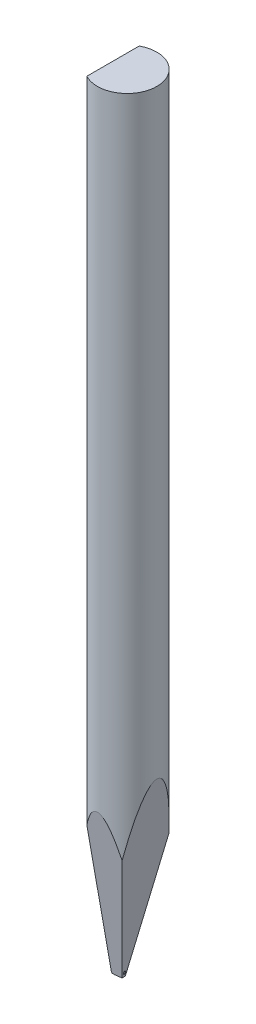
ISO-10303-21;
HEADER;
FILE_DESCRIPTION(('STEP AP214'),'2;1');
FILE_NAME('part.step','',(''),(''),'','','');
FILE_SCHEMA(('AUTOMOTIVE_DESIGN { 1 0 10303 214 1 1 1 1 }'));
ENDSEC;
DATA;
#1=APPLICATION_CONTEXT('core data for automotive mechanical design processes');
#2=APPLICATION_PROTOCOL_DEFINITION('international standard','automotive_design',2000,#1);
#3=PRODUCT_CONTEXT('',#1,'mechanical');
#4=PRODUCT('Part','Part','',(#3));
#5=PRODUCT_RELATED_PRODUCT_CATEGORY('part','',(#4));
#6=PRODUCT_DEFINITION_FORMATION('','',#4);
#7=PRODUCT_DEFINITION_CONTEXT('part definition',#1,'design');
#8=PRODUCT_DEFINITION('design','',#6,#7);
#9=PRODUCT_DEFINITION_SHAPE('','',#8);
#10=(LENGTH_UNIT() NAMED_UNIT(*) SI_UNIT(.MILLI.,.METRE.));
#11=(NAMED_UNIT(*) PLANE_ANGLE_UNIT() SI_UNIT($,.RADIAN.));
#12=(NAMED_UNIT(*) SI_UNIT($,.STERADIAN.) SOLID_ANGLE_UNIT());
#13=UNCERTAINTY_MEASURE_WITH_UNIT(LENGTH_MEASURE(1.E-05),#10,'distance_accuracy_value','');
#14=(GEOMETRIC_REPRESENTATION_CONTEXT(3) GLOBAL_UNCERTAINTY_ASSIGNED_CONTEXT((#13)) GLOBAL_UNIT_ASSIGNED_CONTEXT((#10,
#11,#12)) REPRESENTATION_CONTEXT('',''));
#15=CARTESIAN_POINT('',(0.,0.,0.));
#16=DIRECTION('',(0.,0.,1.));
#17=DIRECTION('',(1.,0.,0.));
#18=AXIS2_PLACEMENT_3D('',#15,#16,#17);
#19=CARTESIAN_POINT('',(26.8738719491216,0.,0.0381));
#20=DIRECTION('',(0.,-0.173648177666931,0.984807753012208));
#21=DIRECTION('',(0.,-0.984807753012208,-0.173648177666931));
#22=AXIS2_PLACEMENT_3D('',#19,#20,#21);
#23=PLANE('',#22);
#24=CARTESIAN_POINT('',(-0.34808,0.02794,0.0430265758409945));
#25=DIRECTION('',(0.,-0.173648177666931,0.984807753012208));
#26=DIRECTION('',(0.,-0.984807753012208,-0.173648177666931));
#27=AXIS2_PLACEMENT_3D('',#24,#25,#26);
#28=ELLIPSE('',#27,0.0283710195360877,0.02794);
#29=CARTESIAN_POINT('',(-0.34808,0.,0.0381));
#30=VERTEX_POINT('',#29);
#31=CARTESIAN_POINT('',(-0.37592,0.0255782210094903,0.0426101304824979));
#32=VERTEX_POINT('',#31);
#33=EDGE_CURVE('E68',#30,#32,#28,.F.);
#34=ORIENTED_EDGE('',*,*,#33,.F.);
#35=DIRECTION('',(-1.,0.,0.));
#36=VECTOR('',#35,1.);
#37=CARTESIAN_POINT('',(26.8738719491216,0.,0.0381));
#38=LINE('',#37,#36);
#39=CARTESIAN_POINT('',(-0.292099999999995,0.,0.0381000000000001));
#40=VERTEX_POINT('',#39);
#41=EDGE_CURVE('E423',#40,#30,#38,.T.);
#42=ORIENTED_EDGE('',*,*,#41,.F.);
#43=DIRECTION('',(-0.98997002855162,-0.139131214142995,-0.0245325869121374));
#44=VECTOR('',#43,1.);
#45=CARTESIAN_POINT('',(26.3316570087555,3.74172503292415,0.697867077696801));
#46=LINE('',#45,#44);
#47=CARTESIAN_POINT('',(-0.0915501457750264,0.0281854439122204,0.0430698542249696));
#48=VERTEX_POINT('',#47);
#49=EDGE_CURVE('E431',#48,#40,#46,.T.);
#50=ORIENTED_EDGE('',*,*,#49,.F.);
#51=DIRECTION('',(-0.171087869746036,-0.970287525247814,-0.171087869746036));
#52=VECTOR('',#51,1.);
#53=CARTESIAN_POINT('',(0.692931938695095,4.47720442738341,0.827551938695093));
#54=LINE('',#53,#52);
#55=CARTESIAN_POINT('',(0.489000739695002,3.32065312604135,0.623620739695));
#56=VERTEX_POINT('',#55);
#57=EDGE_CURVE('E484',#56,#48,#54,.T.);
#58=ORIENTED_EDGE('',*,*,#57,.F.);
#59=CARTESIAN_POINT('',(0.,-0.216075837327433,0.));
#60=DIRECTION('',(0.,-0.173648177666931,0.984807753012208));
#61=DIRECTION('',(0.,-0.984807753012208,-0.173648177666931));
#62=AXIS2_PLACEMENT_3D('',#59,#60,#61);
#63=ELLIPSE('',#62,4.56371043248163,0.792479999999998);
#64=CARTESIAN_POINT('',(-0.37592,3.74046620982329,0.69764511322018));
#65=VERTEX_POINT('',#64);
#66=EDGE_CURVE('E441',#56,#65,#63,.T.);
#67=ORIENTED_EDGE('',*,*,#66,.T.);
#68=DIRECTION('',(0.,0.984807753012208,0.173648177666931));
#69=VECTOR('',#68,1.);
#70=CARTESIAN_POINT('',(-0.37592,20.2532840805181,3.60930043134861));
#71=LINE('',#70,#69);
#72=EDGE_CURVE('E54',#32,#65,#71,.T.);
#73=ORIENTED_EDGE('',*,*,#72,.F.);
#74=EDGE_LOOP('',(#34,#42,#50,#58,#67,#73));
#75=FACE_BOUND('',#74,.T.);
#76=ADVANCED_FACE('F46',(#75),#23,.T.);
#77=CARTESIAN_POINT('',(26.8738719491216,0.,-0.0381));
#78=DIRECTION('',(0.,-0.173648177666931,-0.984807753012208));
#79=DIRECTION('',(0.,0.984807753012208,-0.173648177666931));
#80=AXIS2_PLACEMENT_3D('',#77,#78,#79);
#81=PLANE('',#80);
#82=CARTESIAN_POINT('',(-0.34808,0.02794,-0.0430265758409945));
#83=DIRECTION('',(0.,-0.173648177666931,-0.984807753012208));
#84=DIRECTION('',(0.,0.984807753012208,-0.173648177666931));
#85=AXIS2_PLACEMENT_3D('',#82,#83,#84);
#86=ELLIPSE('',#85,0.0283710195360877,0.02794);
#87=CARTESIAN_POINT('',(-0.37592,0.0255782210094868,-0.042610130482497));
#88=VERTEX_POINT('',#87);
#89=CARTESIAN_POINT('',(-0.34808,0.,-0.0381));
#90=VERTEX_POINT('',#89);
#91=EDGE_CURVE('E189',#88,#90,#86,.F.);
#92=ORIENTED_EDGE('',*,*,#91,.F.);
#93=DIRECTION('',(0.,-0.984807753012208,0.173648177666931));
#94=VECTOR('',#93,1.);
#95=CARTESIAN_POINT('',(-0.37592,20.5277483982937,-3.65769589581418));
#96=LINE('',#95,#94);
#97=CARTESIAN_POINT('',(-0.37592,3.74046620982329,-0.69764511322018));
#98=VERTEX_POINT('',#97);
#99=EDGE_CURVE('E185',#98,#88,#96,.T.);
#100=ORIENTED_EDGE('',*,*,#99,.F.);
#101=CARTESIAN_POINT('',(0.,-0.216075837327433,0.));
#102=DIRECTION('',(0.,-0.173648177666931,-0.984807753012208));
#103=DIRECTION('',(0.,-0.984807753012208,0.173648177666931));
#104=AXIS2_PLACEMENT_3D('',#101,#102,#103);
#105=ELLIPSE('',#104,4.56371043248163,0.792479999999998);
#106=CARTESIAN_POINT('',(0.489000739695002,3.32065312604135,-0.623620739695));
#107=VERTEX_POINT('',#106);
#108=EDGE_CURVE('E490',#98,#107,#105,.T.);
#109=ORIENTED_EDGE('',*,*,#108,.T.);
#110=DIRECTION('',(0.171087869746036,0.970287525247814,-0.171087869746036));
#111=VECTOR('',#110,1.);
#112=CARTESIAN_POINT('',(0.692931938695095,4.47720442738341,-0.827551938695093));
#113=LINE('',#112,#111);
#114=CARTESIAN_POINT('',(-0.0915501457750264,0.0281854439122204,-0.0430698542249696));
#115=VERTEX_POINT('',#114);
#116=EDGE_CURVE('E225',#115,#107,#113,.T.);
#117=ORIENTED_EDGE('',*,*,#116,.F.);
#118=DIRECTION('',(0.98997002855162,0.139131214142995,-0.0245325869121374));
#119=VECTOR('',#118,1.);
#120=CARTESIAN_POINT('',(26.3316570087555,3.74172503292415,-0.697867077696801));
#121=LINE('',#120,#119);
#122=CARTESIAN_POINT('',(-0.292099999999995,0.,-0.0381000000000001));
#123=VERTEX_POINT('',#122);
#124=EDGE_CURVE('E232',#123,#115,#121,.T.);
#125=ORIENTED_EDGE('',*,*,#124,.F.);
#126=DIRECTION('',(-1.,0.,0.));
#127=VECTOR('',#126,1.);
#128=CARTESIAN_POINT('',(26.8738719491216,0.,-0.0381));
#129=LINE('',#128,#127);
#130=EDGE_CURVE('E430',#123,#90,#129,.T.);
#131=ORIENTED_EDGE('',*,*,#130,.T.);
#132=EDGE_LOOP('',(#92,#100,#109,#117,#125,#131));
#133=FACE_BOUND('',#132,.T.);
#134=ADVANCED_FACE('F292',(#133),#81,.T.);
#135=CARTESIAN_POINT('',(0.,0.,0.));
#136=DIRECTION('',(0.,1.,0.));
#137=DIRECTION('',(0.,0.,1.));
#138=AXIS2_PLACEMENT_3D('',#135,#136,#137);
#139=PLANE('',#138);
#140=ORIENTED_EDGE('',*,*,#41,.T.);
#141=DIRECTION('',(0.,0.,-1.));
#142=VECTOR('',#141,1.);
#143=CARTESIAN_POINT('',(-0.34808,0.,26.4500573299132));
#144=LINE('',#143,#142);
#145=CARTESIAN_POINT('',(-0.348080000000001,0.,0.0305592719154106));
#146=VERTEX_POINT('',#145);
#147=EDGE_CURVE('E426',#30,#146,#144,.T.);
#148=ORIENTED_EDGE('',*,*,#147,.T.);
#149=DIRECTION('',(-1.,0.,0.));
#150=VECTOR('',#149,1.);
#151=CARTESIAN_POINT('',(26.7690969491216,0.,0.0305592719154106));
#152=LINE('',#151,#150);
#153=CARTESIAN_POINT('',(-0.2921,0.,0.0305592719154106));
#154=VERTEX_POINT('',#153);
#155=EDGE_CURVE('E329',#154,#146,#152,.T.);
#156=ORIENTED_EDGE('',*,*,#155,.F.);
#157=DIRECTION('',(0.,0.,-1.));
#158=VECTOR('',#157,1.);
#159=CARTESIAN_POINT('',(-0.2921,0.,27.2760283406468));
#160=LINE('',#159,#158);
#161=EDGE_CURVE('E428',#40,#154,#160,.T.);
#162=ORIENTED_EDGE('',*,*,#161,.F.);
#163=EDGE_LOOP('',(#140,#148,#156,#162));
#164=FACE_BOUND('',#163,.T.);
#165=ADVANCED_FACE('F295',(#164),#139,.F.);
#166=DIRECTION('',(-1.,0.,0.));
#167=VECTOR('',#166,1.);
#168=CARTESIAN_POINT('',(26.7690969491216,0.,-0.0305592719154106));
#169=LINE('',#168,#167);
#170=CARTESIAN_POINT('',(-0.2921,0.,-0.0305592719154106));
#171=VERTEX_POINT('',#170);
#172=CARTESIAN_POINT('',(-0.348080000000025,0.,-0.0305592719154106));
#173=VERTEX_POINT('',#172);
#174=EDGE_CURVE('E337',#171,#173,#169,.T.);
#175=ORIENTED_EDGE('',*,*,#174,.T.);
#176=EDGE_CURVE('E436',#173,#90,#144,.T.);
#177=ORIENTED_EDGE('',*,*,#176,.T.);
#178=ORIENTED_EDGE('',*,*,#130,.F.);
#179=EDGE_CURVE('E479',#171,#123,#160,.T.);
#180=ORIENTED_EDGE('',*,*,#179,.F.);
#181=EDGE_LOOP('',(#175,#177,#178,#180));
#182=FACE_BOUND('',#181,.T.);
#183=ADVANCED_FACE('F288',(#182),#139,.F.);
#184=CARTESIAN_POINT('',(-0.2921,0.,27.2760283406468));
#185=DIRECTION('',(-0.139173100960066,0.99026806874157,0.));
#186=DIRECTION('',(-0.99026806874157,-0.139173100960066,0.));
#187=AXIS2_PLACEMENT_3D('',#184,#185,#186);
#188=PLANE('',#187);
#189=ORIENTED_EDGE('',*,*,#161,.T.);
#190=CARTESIAN_POINT('',(-1.15056935700565,-0.12065,0.));
#191=DIRECTION('',(-0.139173100960066,0.99026806874157,0.));
#192=DIRECTION('',(-0.99026806874157,-0.139173100960066,0.));
#193=AXIS2_PLACEMENT_3D('',#190,#191,#192);
#194=ELLIPSE('',#193,0.894282006662425,0.12446);
#195=CARTESIAN_POINT('',(-0.274468050343871,0.00247800892209942,0.0181599839999999));
#196=VERTEX_POINT('',#195);
#197=EDGE_CURVE('E452',#154,#196,#194,.T.);
#198=ORIENTED_EDGE('',*,*,#197,.T.);
#199=DIRECTION('',(-0.99026806874157,-0.139173100960066,0.));
#200=VECTOR('',#199,1.);
#201=CARTESIAN_POINT('',(-0.2921,0.,0.0181599839999998));
#202=LINE('',#201,#200);
#203=CARTESIAN_POINT('',(-0.18288,0.0153498699661953,0.0181599839999999));
#204=VERTEX_POINT('',#203);
#205=EDGE_CURVE('E245',#204,#196,#202,.T.);
#206=ORIENTED_EDGE('',*,*,#205,.F.);
#207=DIRECTION('',(0.,0.,1.));
#208=VECTOR('',#207,1.);
#209=CARTESIAN_POINT('',(-0.18288,0.0153498699661952,27.2760283406468));
#210=LINE('',#209,#208);
#211=CARTESIAN_POINT('',(-0.18288,0.0153498699661953,-0.0181599839999999));
#212=VERTEX_POINT('',#211);
#213=EDGE_CURVE('E243',#212,#204,#210,.T.);
#214=ORIENTED_EDGE('',*,*,#213,.F.);
#215=DIRECTION('',(-0.99026806874157,-0.139173100960066,0.));
#216=VECTOR('',#215,1.);
#217=CARTESIAN_POINT('',(-0.2921,0.,-0.0181599839999998));
#218=LINE('',#217,#216);
#219=CARTESIAN_POINT('',(-0.274468050343871,0.00247800892209942,-0.0181599839999999));
#220=VERTEX_POINT('',#219);
#221=EDGE_CURVE('E235',#212,#220,#218,.T.);
#222=ORIENTED_EDGE('',*,*,#221,.T.);
#223=EDGE_CURVE('E347',#220,#171,#194,.T.);
#224=ORIENTED_EDGE('',*,*,#223,.T.);
#225=ORIENTED_EDGE('',*,*,#179,.T.);
#226=ORIENTED_EDGE('',*,*,#124,.T.);
#227=DIRECTION('',(0.,0.,-1.));
#228=VECTOR('',#227,1.);
#229=CARTESIAN_POINT('',(-0.0915501457750305,0.0281854439122202,27.2760283406468));
#230=LINE('',#229,#228);
#231=EDGE_CURVE('E239',#48,#115,#230,.T.);
#232=ORIENTED_EDGE('',*,*,#231,.F.);
#233=ORIENTED_EDGE('',*,*,#49,.T.);
#234=EDGE_LOOP('',(#189,#198,#206,#214,#222,#224,#225,#226,#232,#233));
#235=FACE_BOUND('',#234,.T.);
#236=ADVANCED_FACE('F284',(#235),#188,.F.);
#237=CARTESIAN_POINT('',(0.,21.0312,0.));
#238=DIRECTION('',(0.,-1.,0.));
#239=DIRECTION('',(0.,0.,-1.));
#240=AXIS2_PLACEMENT_3D('',#237,#238,#239);
#241=CYLINDRICAL_SURFACE('',#240,0.792479999999998);
#242=ORIENTED_EDGE('',*,*,#66,.F.);
#243=CARTESIAN_POINT('',(0.,0.547392121229499,0.));
#244=DIRECTION('',(-0.984807753012208,0.173648177666931,0.));
#245=DIRECTION('',(-0.173648177666931,-0.984807753012208,0.));
#246=AXIS2_PLACEMENT_3D('',#243,#244,#245);
#247=ELLIPSE('',#246,4.56371043248165,0.792479999999998);
#248=EDGE_CURVE('E481',#56,#107,#247,.T.);
#249=ORIENTED_EDGE('',*,*,#248,.T.);
#250=ORIENTED_EDGE('',*,*,#108,.F.);
#251=DIRECTION('',(0.,-1.,0.));
#252=VECTOR('',#251,1.);
#253=CARTESIAN_POINT('',(-0.37592,21.0312,-0.69764511322018));
#254=LINE('',#253,#252);
#255=CARTESIAN_POINT('',(-0.37592,21.0312,-0.69764511322018));
#256=VERTEX_POINT('',#255);
#257=EDGE_CURVE('E496',#256,#98,#254,.T.);
#258=ORIENTED_EDGE('',*,*,#257,.F.);
#259=CARTESIAN_POINT('',(0.,21.0312,0.));
#260=DIRECTION('',(0.,1.,0.));
#261=DIRECTION('',(0.,0.,1.));
#262=AXIS2_PLACEMENT_3D('',#259,#260,#261);
#263=CIRCLE('',#262,0.792479999999998);
#264=CARTESIAN_POINT('',(-0.37592,21.0312,0.69764511322018));
#265=VERTEX_POINT('',#264);
#266=EDGE_CURVE('E497',#265,#256,#263,.T.);
#267=ORIENTED_EDGE('',*,*,#266,.F.);
#268=DIRECTION('',(0.,-1.,0.));
#269=VECTOR('',#268,1.);
#270=CARTESIAN_POINT('',(-0.37592,21.0312,0.69764511322018));
#271=LINE('',#270,#269);
#272=EDGE_CURVE('E494',#65,#265,#271,.F.);
#273=ORIENTED_EDGE('',*,*,#272,.F.);
#274=EDGE_LOOP('',(#242,#249,#250,#258,#267,#273));
#275=FACE_BOUND('',#274,.T.);
#276=ADVANCED_FACE('F287',(#275),#241,.T.);
#277=CARTESIAN_POINT('',(-0.37592,21.0312,-0.80247998));
#278=DIRECTION('',(-1.,0.,0.));
#279=DIRECTION('',(0.,0.,1.));
#280=AXIS2_PLACEMENT_3D('',#277,#278,#279);
#281=PLANE('',#280);
#282=CARTESIAN_POINT('',(-0.37592,0.,0.0305592719154106));
#283=CARTESIAN_POINT('',(-0.37592,0.0146958072941779,0.023773050294587));
#284=CARTESIAN_POINT('',(-0.37592,0.0292100000000017,0.0123620164096919));
#285=CARTESIAN_POINT('',(-0.37592,0.0292100000000017,-0.0123620164096919));
#286=CARTESIAN_POINT('',(-0.37592,0.014695807294178,-0.0237730502945872));
#287=CARTESIAN_POINT('',(-0.37592,0.,-0.0305592719154106));
#288=(BOUNDED_CURVE() B_SPLINE_CURVE(3,(#282,#283,#284,#285,#286,#287),.UNSPECIFIED.,.F.,
.F.) B_SPLINE_CURVE_WITH_KNOTS((4,2,4),(1.32272489561682,1.5707963267949,1.81886775797297),
.UNSPECIFIED.) CURVE() GEOMETRIC_REPRESENTATION_ITEM() RATIONAL_B_SPLINE_CURVE((1.,1.,1.,1.,1.,1.)) REPRESENTATION_ITEM(''));
#289=CARTESIAN_POINT('',(-0.375920000000385,0.0255781736680453,-0.0110105496458275));
#290=VERTEX_POINT('',#289);
#291=CARTESIAN_POINT('',(-0.37592,0.0255781380673789,0.0109137403964379));
#292=VERTEX_POINT('',#291);
#293=EDGE_CURVE('E172',#290,#292,#288,.F.);
#294=ORIENTED_EDGE('',*,*,#293,.T.);
#295=DIRECTION('',(0.,0.,-1.));
#296=VECTOR('',#295,1.);
#297=CARTESIAN_POINT('',(-0.37592,0.0255782210094911,26.4500573299132));
#298=LINE('',#297,#296);
#299=EDGE_CURVE('E76',#32,#292,#298,.T.);
#300=ORIENTED_EDGE('',*,*,#299,.F.);
#301=ORIENTED_EDGE('',*,*,#72,.T.);
#302=ORIENTED_EDGE('',*,*,#272,.T.);
#303=DIRECTION('',(0.,0.,-1.));
#304=VECTOR('',#303,1.);
#305=CARTESIAN_POINT('',(-0.37592,21.0312,-0.80247998));
#306=LINE('',#305,#304);
#307=EDGE_CURVE('E492',#265,#256,#306,.T.);
#308=ORIENTED_EDGE('',*,*,#307,.T.);
#309=ORIENTED_EDGE('',*,*,#257,.T.);
#310=ORIENTED_EDGE('',*,*,#99,.T.);
#311=EDGE_CURVE('E182',#290,#88,#298,.T.);
#312=ORIENTED_EDGE('',*,*,#311,.F.);
#313=EDGE_LOOP('',(#294,#300,#301,#302,#308,#309,#310,#312));
#314=FACE_BOUND('',#313,.T.);
#315=ADVANCED_FACE('F183',(#314),#281,.T.);
#316=CARTESIAN_POINT('',(0.,21.0312,0.));
#317=DIRECTION('',(0.,1.,0.));
#318=DIRECTION('',(0.,0.,1.));
#319=AXIS2_PLACEMENT_3D('',#316,#317,#318);
#320=PLANE('',#319);
#321=ORIENTED_EDGE('',*,*,#266,.T.);
#322=ORIENTED_EDGE('',*,*,#307,.F.);
#323=EDGE_LOOP('',(#321,#322));
#324=FACE_BOUND('',#323,.T.);
#325=ADVANCED_FACE('F282',(#324),#320,.T.);
#326=CARTESIAN_POINT('',(-0.0915501457750305,0.0281854439122202,27.2760283406468));
#327=DIRECTION('',(-0.984807753012208,0.173648177666931,0.));
#328=DIRECTION('',(-0.173648177666931,-0.984807753012208,0.));
#329=AXIS2_PLACEMENT_3D('',#326,#327,#328);
#330=PLANE('',#329);
#331=CARTESIAN_POINT('',(-0.0727641160274862,0.134726312882266,0.));
#332=DIRECTION('',(-0.984807753012208,0.173648177666931,0.));
#333=DIRECTION('',(0.173648177666931,0.984807753012208,0.));
#334=AXIS2_PLACEMENT_3D('',#331,#332,#333);
#335=ELLIPSE('',#334,0.0414092308592137,0.0297436573060463);
#336=CARTESIAN_POINT('',(-0.0655734785501945,0.175506444478692,0.));
#337=VERTEX_POINT('',#336);
#338=EDGE_CURVE('E236',#337,#337,#335,.F.);
#339=ORIENTED_EDGE('',*,*,#338,.F.);
#340=EDGE_LOOP('',(#339));
#341=FACE_BOUND('',#340,.T.);
#342=ORIENTED_EDGE('',*,*,#248,.F.);
#343=ORIENTED_EDGE('',*,*,#57,.T.);
#344=ORIENTED_EDGE('',*,*,#231,.T.);
#345=ORIENTED_EDGE('',*,*,#116,.T.);
#346=EDGE_LOOP('',(#342,#343,#344,#345));
#347=FACE_BOUND('',#346,.T.);
#348=ADVANCED_FACE('F278',(#341,#347),#330,.F.);
#349=CARTESIAN_POINT('',(-0.18288,0.0584200000000001,0.018159984));
#350=DIRECTION('',(-1.,0.,0.));
#351=DIRECTION('',(0.,0.,1.));
#352=AXIS2_PLACEMENT_3D('',#349,#350,#351);
#353=PLANE('',#352);
#354=ORIENTED_EDGE('',*,*,#213,.T.);
#355=DIRECTION('',(0.,1.,0.));
#356=VECTOR('',#355,1.);
#357=CARTESIAN_POINT('',(-0.18288,0.0584200000000001,0.018159984));
#358=LINE('',#357,#356);
#359=CARTESIAN_POINT('',(-0.18288,0.0584200000000001,0.018159984));
#360=VERTEX_POINT('',#359);
#361=EDGE_CURVE('E466',#204,#360,#358,.T.);
#362=ORIENTED_EDGE('',*,*,#361,.T.);
#363=DIRECTION('',(0.,0.,-1.));
#364=VECTOR('',#363,1.);
#365=CARTESIAN_POINT('',(-0.18288,0.0584200000000001,0.018159984));
#366=LINE('',#365,#364);
#367=CARTESIAN_POINT('',(-0.18288,0.0584200000000001,0.01778));
#368=VERTEX_POINT('',#367);
#369=EDGE_CURVE('E473',#360,#368,#366,.T.);
#370=ORIENTED_EDGE('',*,*,#369,.T.);
#371=CARTESIAN_POINT('',(-0.18288,0.0584200000000001,0.));
#372=DIRECTION('',(1.,0.,0.));
#373=DIRECTION('',(0.,1.,0.));
#374=AXIS2_PLACEMENT_3D('',#371,#372,#373);
#375=ELLIPSE('',#374,0.0205305755723831,0.01778);
#376=CARTESIAN_POINT('',(-0.18288,0.0584200000000001,-0.0177799999999985));
#377=VERTEX_POINT('',#376);
#378=EDGE_CURVE('E459',#377,#368,#375,.F.);
#379=ORIENTED_EDGE('',*,*,#378,.F.);
#380=CARTESIAN_POINT('',(-0.18288,0.0584200000000001,-0.018159984));
#381=VERTEX_POINT('',#380);
#382=EDGE_CURVE('E469',#377,#381,#366,.T.);
#383=ORIENTED_EDGE('',*,*,#382,.T.);
#384=DIRECTION('',(0.,1.,0.));
#385=VECTOR('',#384,1.);
#386=CARTESIAN_POINT('',(-0.18288,0.0584200000000001,-0.018159984));
#387=LINE('',#386,#385);
#388=EDGE_CURVE('E467',#212,#381,#387,.T.);
#389=ORIENTED_EDGE('',*,*,#388,.F.);
#390=EDGE_LOOP('',(#354,#362,#370,#379,#383,#389));
#391=FACE_BOUND('',#390,.T.);
#392=ADVANCED_FACE('F281',(#391),#353,.T.);
#393=CARTESIAN_POINT('',(0.,0.,0.018159984));
#394=DIRECTION('',(0.,0.,-1.));
#395=DIRECTION('',(-1.,0.,0.));
#396=AXIS2_PLACEMENT_3D('',#393,#394,#395);
#397=PLANE('',#396);
#398=DIRECTION('',(-1.,0.,0.));
#399=VECTOR('',#398,1.);
#400=CARTESIAN_POINT('',(26.7690969491216,0.00247800892209596,0.018159984));
#401=LINE('',#400,#399);
#402=CARTESIAN_POINT('',(-0.303053922822618,0.00247800892209512,0.018159984));
#403=VERTEX_POINT('',#402);
#404=EDGE_CURVE('E259',#403,#196,#401,.F.);
#405=ORIENTED_EDGE('',*,*,#404,.F.);
#406=DIRECTION('',(-0.601815023152052,-0.79863551004729,0.));
#407=VECTOR('',#406,1.);
#408=CARTESIAN_POINT('',(-0.194484459919207,0.146554552454174,0.018159984));
#409=LINE('',#408,#407);
#410=CARTESIAN_POINT('',(-0.260898608875048,0.0584200000000001,0.018159984));
#411=VERTEX_POINT('',#410);
#412=EDGE_CURVE('E356',#411,#403,#409,.T.);
#413=ORIENTED_EDGE('',*,*,#412,.F.);
#414=DIRECTION('',(-1.,0.,0.));
#415=VECTOR('',#414,1.);
#416=CARTESIAN_POINT('',(-0.283637372392994,0.0584200000000001,0.018159984));
#417=LINE('',#416,#415);
#418=EDGE_CURVE('E463',#360,#411,#417,.T.);
#419=ORIENTED_EDGE('',*,*,#418,.F.);
#420=ORIENTED_EDGE('',*,*,#361,.F.);
#421=ORIENTED_EDGE('',*,*,#205,.T.);
#422=EDGE_LOOP('',(#405,#413,#419,#420,#421));
#423=FACE_BOUND('',#422,.T.);
#424=ADVANCED_FACE('F524',(#423),#397,.T.);
#425=CARTESIAN_POINT('',(0.,0.,-0.018159984));
#426=DIRECTION('',(0.,0.,-1.));
#427=DIRECTION('',(-1.,0.,0.));
#428=AXIS2_PLACEMENT_3D('',#425,#426,#427);
#429=PLANE('',#428);
#430=DIRECTION('',(0.601815023152052,0.79863551004729,0.));
#431=VECTOR('',#430,1.);
#432=CARTESIAN_POINT('',(-0.260898608875048,0.0584200000000001,-0.018159984));
#433=LINE('',#432,#431);
#434=CARTESIAN_POINT('',(-0.303053922822618,0.00247800892209512,-0.018159984));
#435=VERTEX_POINT('',#434);
#436=CARTESIAN_POINT('',(-0.260898608875048,0.0584200000000001,-0.018159984));
#437=VERTEX_POINT('',#436);
#438=EDGE_CURVE('E354',#435,#437,#433,.T.);
#439=ORIENTED_EDGE('',*,*,#438,.F.);
#440=DIRECTION('',(-1.,0.,0.));
#441=VECTOR('',#440,1.);
#442=CARTESIAN_POINT('',(26.7690969491216,0.00247800892209596,-0.018159984));
#443=LINE('',#442,#441);
#444=EDGE_CURVE('E340',#435,#220,#443,.F.);
#445=ORIENTED_EDGE('',*,*,#444,.T.);
#446=ORIENTED_EDGE('',*,*,#221,.F.);
#447=ORIENTED_EDGE('',*,*,#388,.T.);
#448=DIRECTION('',(-1.,0.,0.));
#449=VECTOR('',#448,1.);
#450=CARTESIAN_POINT('',(-0.283637372392994,0.0584200000000001,-0.018159984));
#451=LINE('',#450,#449);
#452=EDGE_CURVE('E462',#381,#437,#451,.T.);
#453=ORIENTED_EDGE('',*,*,#452,.T.);
#454=EDGE_LOOP('',(#439,#445,#446,#447,#453));
#455=FACE_BOUND('',#454,.T.);
#456=ADVANCED_FACE('F531',(#455),#429,.F.);
#457=CARTESIAN_POINT('',(-0.0963995633484462,0.10834950338041,0.));
#458=DIRECTION('',(0.866025403784441,0.499999999999995,0.));
#459=DIRECTION('',(-0.499999999999995,0.866025403784441,0.));
#460=AXIS2_PLACEMENT_3D('',#457,#458,#459);
#461=CONICAL_SURFACE('',#460,0.01778,0.392699081698725);
#462=CARTESIAN_POINT('',(-0.0963995633484462,0.10834950338041,0.));
#463=DIRECTION('',(0.866025403784441,0.499999999999995,0.));
#464=DIRECTION('',(-0.499999999999995,0.866025403784441,0.));
#465=AXIS2_PLACEMENT_3D('',#462,#463,#464);
#466=CIRCLE('',#465,0.01778);
#467=CARTESIAN_POINT('',(-0.105289563348446,0.123747435059698,0.));
#468=VERTEX_POINT('',#467);
#469=EDGE_CURVE('E453',#468,#468,#466,.T.);
#470=ORIENTED_EDGE('',*,*,#469,.F.);
#471=EDGE_LOOP('',(#470));
#472=FACE_BOUND('',#471,.T.);
#473=ORIENTED_EDGE('',*,*,#338,.T.);
#474=EDGE_LOOP('',(#473));
#475=FACE_BOUND('',#474,.T.);
#476=ADVANCED_FACE('F276',(#472,#475),#461,.F.);
#477=CARTESIAN_POINT('',(-0.260898608875048,0.0584200000000001,0.));
#478=DIRECTION('',(-0.601815023152052,-0.79863551004729,0.));
#479=DIRECTION('',(0.79863551004729,-0.601815023152052,0.));
#480=AXIS2_PLACEMENT_3D('',#477,#478,#479);
#481=CYLINDRICAL_SURFACE('',#480,0.018159984);
#482=ORIENTED_EDGE('',*,*,#412,.T.);
#483=CARTESIAN_POINT('',(-0.303053922822736,0.00247800892209597,-0.018159984));
#484=CARTESIAN_POINT('',(-0.308295249938806,0.00572887844539172,-0.018159983999968));
#485=CARTESIAN_POINT('',(-0.312399812258504,0.00720553047005114,-0.0156101629119765));
#486=CARTESIAN_POINT('',(-0.31845121380343,0.00929034870866281,-0.00900586095826379));
#487=CARTESIAN_POINT('',(-0.320237250564493,0.00987700287008611,-0.00450275497327118));
#488=CARTESIAN_POINT('',(-0.320194728345634,0.00987969009742846,0.00463135779326514));
#489=CARTESIAN_POINT('',(-0.318400835768885,0.00929391720285308,0.00907433390963836));
#490=CARTESIAN_POINT('',(-0.312314892665398,0.00721205913510192,0.0156518657142142));
#491=CARTESIAN_POINT('',(-0.308251962042215,0.00570974080039358,0.0181599839999998));
#492=CARTESIAN_POINT('',(-0.303053922822618,0.00247800892209597,0.018159984));
#493=(BOUNDED_CURVE() B_SPLINE_CURVE(3,(#483,#484,#485,#486,#487,#488,#489,#490,#491,#492),
.UNSPECIFIED.,.F.,.F.) B_SPLINE_CURVE_WITH_KNOTS((4,2,2,2,4),(0.,1.56146603035385E-05,
3.1229320607077E-05,4.68439809106155E-05,6.24586412141541E-05),
.UNSPECIFIED.) CURVE() GEOMETRIC_REPRESENTATION_ITEM() RATIONAL_B_SPLINE_CURVE((1.,1.,1.,1.,1.,
1.,1.,1.,1.,1.)) REPRESENTATION_ITEM(''));
#494=EDGE_CURVE('E248',#403,#435,#493,.F.);
#495=ORIENTED_EDGE('',*,*,#494,.T.);
#496=ORIENTED_EDGE('',*,*,#438,.T.);
#497=CARTESIAN_POINT('',(-0.260898608875048,0.0584200000000001,0.));
#498=DIRECTION('',(0.,-1.,0.));
#499=DIRECTION('',(-1.,0.,0.));
#500=AXIS2_PLACEMENT_3D('',#497,#498,#499);
#501=ELLIPSE('',#500,0.0227387635179466,0.018159984);
#502=EDGE_CURVE('E240',#437,#411,#501,.F.);
#503=ORIENTED_EDGE('',*,*,#502,.T.);
#504=EDGE_LOOP('',(#482,#495,#496,#503));
#505=FACE_BOUND('',#504,.T.);
#506=ADVANCED_FACE('F262',(#505),#481,.F.);
#507=CARTESIAN_POINT('',(-0.283637372392994,0.0584200000000001,0.018159984));
#508=DIRECTION('',(0.,-1.,0.));
#509=DIRECTION('',(1.,0.,0.));
#510=AXIS2_PLACEMENT_3D('',#507,#508,#509);
#511=PLANE('',#510);
#512=ORIENTED_EDGE('',*,*,#452,.F.);
#513=ORIENTED_EDGE('',*,*,#382,.F.);
#514=CARTESIAN_POINT('',(-0.18288,0.0584200000000001,0.));
#515=DIRECTION('',(0.,1.,0.));
#516=DIRECTION('',(1.,0.,0.));
#517=AXIS2_PLACEMENT_3D('',#514,#515,#516);
#518=ELLIPSE('',#517,0.0355600000000004,0.01778);
#519=EDGE_CURVE('E456',#368,#377,#518,.F.);
#520=ORIENTED_EDGE('',*,*,#519,.F.);
#521=ORIENTED_EDGE('',*,*,#369,.F.);
#522=ORIENTED_EDGE('',*,*,#418,.T.);
#523=ORIENTED_EDGE('',*,*,#502,.F.);
#524=EDGE_LOOP('',(#512,#513,#520,#521,#522,#523));
#525=FACE_BOUND('',#524,.T.);
#526=ADVANCED_FACE('F275',(#525),#511,.T.);
#527=CARTESIAN_POINT('',(-0.349394299618203,-0.0377170757084904,0.));
#528=DIRECTION('',(0.866025403784441,0.499999999999995,0.));
#529=DIRECTION('',(-0.499999999999995,0.866025403784441,0.));
#530=AXIS2_PLACEMENT_3D('',#527,#528,#529);
#531=CYLINDRICAL_SURFACE('',#530,0.01778);
#532=ORIENTED_EDGE('',*,*,#378,.T.);
#533=ORIENTED_EDGE('',*,*,#519,.T.);
#534=EDGE_LOOP('',(#532,#533));
#535=FACE_BOUND('',#534,.T.);
#536=ORIENTED_EDGE('',*,*,#469,.T.);
#537=EDGE_LOOP('',(#536));
#538=FACE_BOUND('',#537,.T.);
#539=ADVANCED_FACE('F555',(#535,#538),#531,.F.);
#540=CARTESIAN_POINT('',(26.7690969491216,-0.12065,0.));
#541=DIRECTION('',(-1.,0.,0.));
#542=DIRECTION('',(0.,0.,1.));
#543=AXIS2_PLACEMENT_3D('',#540,#541,#542);
#544=CYLINDRICAL_SURFACE('',#543,0.12446);
#545=ORIENTED_EDGE('',*,*,#155,.T.);
#546=CARTESIAN_POINT('',(-0.34808,0.,0.0305592719154105));
#547=CARTESIAN_POINT('',(-0.348530814510365,-4.07901574044085E-07,0.0305605813864631));
#548=CARTESIAN_POINT('',(-0.348979913015498,1.08939864350214E-05,0.0305162789202462));
#549=CARTESIAN_POINT('',(-0.349856979795945,5.32586660468613E-05,0.030348424748305));
#550=CARTESIAN_POINT('',(-0.350285131865885,8.40923596505238E-05,0.030225791682826));
#551=CARTESIAN_POINT('',(-0.351111762424045,0.000161841460247331,0.0299134495677674));
#552=CARTESIAN_POINT('',(-0.351510362022562,0.000208686245204436,0.0297240349657187));
#553=CARTESIAN_POINT('',(-0.352276540220128,0.000314247686217669,0.0292915141713708));
#554=CARTESIAN_POINT('',(-0.352644019029949,0.00037300062351211,0.029048243679112));
#555=CARTESIAN_POINT('',(-0.353592609976714,0.000542464303570029,0.0283352771344419));
#556=CARTESIAN_POINT('',(-0.354142823136011,0.000660718500816281,0.0278264292093501));
#557=CARTESIAN_POINT('',(-0.355158485849617,0.000906480045085741,0.0267326241717133));
#558=CARTESIAN_POINT('',(-0.355623692710971,0.00103401247561591,0.0261474570746312));
#559=CARTESIAN_POINT('',(-0.356837267127974,0.00139509322037841,0.024424665265501));
#560=CARTESIAN_POINT('',(-0.357502825120589,0.00162934905892419,0.0232293596959536));
#561=CARTESIAN_POINT('',(-0.358660754617679,0.00207372872141575,0.0207553925747807));
#562=CARTESIAN_POINT('',(-0.359152698197646,0.00228379206987496,0.0194765341415885));
#563=CARTESIAN_POINT('',(-0.36040774701552,0.0028495843400985,0.0156411550181883));
#564=CARTESIAN_POINT('',(-0.360988602450784,0.00315568845104849,0.0130178775361172));
#565=CARTESIAN_POINT('',(-0.361806163735848,0.00360035199279706,0.00770331230592786));
#566=CARTESIAN_POINT('',(-0.362041722221542,0.00373835258818556,0.00501182791337142));
#567=CARTESIAN_POINT('',(-0.362222159422928,0.00384312710698266,-0.000626307070904429));
#568=CARTESIAN_POINT('',(-0.362139043463169,0.00379341669557573,-0.00357417277699149));
#569=CARTESIAN_POINT('',(-0.36160170314798,0.00348744188955353,-0.00941520395438306));
#570=CARTESIAN_POINT('',(-0.361149465589899,0.0032322834184667,-0.0123085776336631));
#571=CARTESIAN_POINT('',(-0.360201881253082,0.00276522394071858,-0.0161243719322802));
#572=CARTESIAN_POINT('',(-0.359923561043634,0.00263206670724784,-0.0171113029227184));
#573=CARTESIAN_POINT('',(-0.359291091592352,0.00234550293161941,-0.0190622381461742));
#574=CARTESIAN_POINT('',(-0.358936664817193,0.00219202308727775,-0.0200261437209396));
#575=CARTESIAN_POINT('',(-0.35802019094462,0.00182196264863963,-0.0221910750494741));
#576=CARTESIAN_POINT('',(-0.35742773854375,0.00160009037378038,-0.0233785738678839));
#577=CARTESIAN_POINT('',(-0.356041185679961,0.00114822728257014,-0.0256274014231927));
#578=CARTESIAN_POINT('',(-0.35524861217987,0.000918308819136077,-0.0266895999907305));
#579=CARTESIAN_POINT('',(-0.353969594547934,0.000625501592054868,-0.0279764742692962));
#580=CARTESIAN_POINT('',(-0.353598623594593,0.000547541257563641,-0.0283116735867267));
#581=CARTESIAN_POINT('',(-0.352813845163361,0.000401035258663613,-0.0289316105181224));
#582=CARTESIAN_POINT('',(-0.352400015965373,0.000332494409296566,-0.029216322345379));
#583=CARTESIAN_POINT('',(-0.35152414885153,0.000209524327572557,-0.0297209697927658));
#584=CARTESIAN_POINT('',(-0.351061529273433,0.000155300800887018,-0.0299399667559708));
#585=CARTESIAN_POINT('',(-0.350101496573154,6.9114044338518E-05,-0.030285638001186));
#586=CARTESIAN_POINT('',(-0.349604228801302,3.70633361955646E-05,-0.0304126751846491));
#587=CARTESIAN_POINT('',(-0.348930789757912,1.24370193427343E-05,-0.0305101337557274));
#588=CARTESIAN_POINT('',(-0.348761251457123,7.7864989271103E-06,-0.0305285162109278));
#589=CARTESIAN_POINT('',(-0.348421176485651,1.56788977350457E-06,-0.0305530840375709));
#590=CARTESIAN_POINT('',(-0.348250639475355,9.18970774199183E-10,-0.0305592649853821));
#591=CARTESIAN_POINT('',(-0.348080000000024,0.,-0.0305592719155781));
#592=B_SPLINE_CURVE_WITH_KNOTS('',3,(#546,#547,#548,#549,#550,#551,#552,#553,#554,#555,#556,
#557,#558,#559,#560,#561,#562,#563,#564,#565,#566,#567,#568,#569,#570,#571,#572,#573,#574,#575,
#576,#577,#578,#579,#580,#581,#582,#583,#584,#585,#586,#587,#588,#589,#590,#591),.UNSPECIFIED.,
.F.,.F.,(4,2,2,2,2,2,2,2,2,2,2,2,2,2,2,2,2,2,2,2,2,2,4),(0.,0.00134741004079565,
0.00267930111383717,0.00400539168870862,0.00533558497102965,0.00759858100656418,
0.00986794025135313,0.0140085166125865,0.0181592285296515,0.0262271883927136,0.0343218964425104,
0.0431433167180926,0.0519175663828489,0.0550173321670427,0.0581285996977778,0.062153863305168,
0.0661492954960549,0.0676639727026797,0.0691794213229864,0.0707155853403854,0.0722456536356858,
0.0727570681004676,0.0732686679434899),.UNSPECIFIED.);
#593=CARTESIAN_POINT('',(-0.359941703044885,0.00265114145177237,0.0169366447636366));
#594=VERTEX_POINT('',#593);
#595=EDGE_CURVE('E435',#146,#594,#592,.T.);
#596=ORIENTED_EDGE('',*,*,#595,.T.);
#597=CARTESIAN_POINT('',(-0.37592,0.,-0.0305592719154106));
#598=CARTESIAN_POINT('',(-0.363216800126761,0.00252588537008308,-0.0205869116201758));
#599=CARTESIAN_POINT('',(-0.35052,0.00381000000000001,-0.0102906602127608));
#600=CARTESIAN_POINT('',(-0.35052,0.00381000000000001,0.0102906602127608));
#601=CARTESIAN_POINT('',(-0.363216800126761,0.0025258853700831,0.0205869116201757));
#602=CARTESIAN_POINT('',(-0.37592,0.,0.0305592719154106));
#603=(BOUNDED_CURVE() B_SPLINE_CURVE(3,(#597,#598,#599,#600,#601,#602),.UNSPECIFIED.,.F.,
.F.) B_SPLINE_CURVE_WITH_KNOTS((4,2,4),(1.32272489561682,1.5707963267949,1.81886775797297),
.UNSPECIFIED.) CURVE() GEOMETRIC_REPRESENTATION_ITEM() RATIONAL_B_SPLINE_CURVE((1.,1.,1.,1.,1.,1.)) REPRESENTATION_ITEM(''));
#604=CARTESIAN_POINT('',(-0.359941632370162,0.00265114327038936,-0.0169366315095969));
#605=VERTEX_POINT('',#604);
#606=EDGE_CURVE('E178',#594,#605,#603,.F.);
#607=ORIENTED_EDGE('',*,*,#606,.T.);
#608=EDGE_CURVE('E190',#605,#173,#592,.T.);
#609=ORIENTED_EDGE('',*,*,#608,.T.);
#610=ORIENTED_EDGE('',*,*,#174,.F.);
#611=ORIENTED_EDGE('',*,*,#223,.F.);
#612=ORIENTED_EDGE('',*,*,#444,.F.);
#613=CARTESIAN_POINT('',(-0.303053922822618,0.00247800892209597,0.018159984));
#614=CARTESIAN_POINT('',(-0.308274907200452,0.00200477157049832,0.0213686196931694));
#615=CARTESIAN_POINT('',(-0.315368339755767,0.00201195802604796,0.0213527005379504));
#616=CARTESIAN_POINT('',(-0.327605747588924,0.00299622670512615,0.0146117893713212));
#617=CARTESIAN_POINT('',(-0.332354412146537,0.00380362356694916,0.00758489701439717));
#618=CARTESIAN_POINT('',(-0.332419824513176,0.00381628723822762,-0.00737417268538746));
#619=CARTESIAN_POINT('',(-0.327680141217822,0.00300937936997028,-0.0145060764837201));
#620=CARTESIAN_POINT('',(-0.31547623257219,0.00202215111469151,-0.0212981619397462));
#621=CARTESIAN_POINT('',(-0.30832081635325,0.00200158311670829,-0.0213902379923213));
#622=CARTESIAN_POINT('',(-0.303053922822736,0.00247800892209597,-0.018159984));
#623=(BOUNDED_CURVE() B_SPLINE_CURVE(3,(#613,#614,#615,#616,#617,#618,#619,#620,#621,#622),
.UNSPECIFIED.,.F.,.F.) B_SPLINE_CURVE_WITH_KNOTS((4,2,2,2,4),(0.,1.56146603035385E-05,
3.1229320607077E-05,4.68439809106155E-05,6.24586412141541E-05),
.UNSPECIFIED.) CURVE() GEOMETRIC_REPRESENTATION_ITEM() RATIONAL_B_SPLINE_CURVE((1.,1.,1.,1.,1.,
1.,1.,1.,1.,1.)) REPRESENTATION_ITEM(''));
#624=EDGE_CURVE('E360',#435,#403,#623,.F.);
#625=ORIENTED_EDGE('',*,*,#624,.T.);
#626=ORIENTED_EDGE('',*,*,#404,.T.);
#627=ORIENTED_EDGE('',*,*,#197,.F.);
#628=EDGE_LOOP('',(#545,#596,#607,#609,#610,#611,#612,#625,#626,#627));
#629=FACE_BOUND('',#628,.T.);
#630=ADVANCED_FACE('F207',(#629),#544,.F.);
#631=CARTESIAN_POINT('',(-0.303053922822618,0.00247800892209597,0.018159984));
#632=CARTESIAN_POINT('',(-0.308251962042215,0.00570974080039358,0.0181599839999998));
#633=CARTESIAN_POINT('',(-0.312314892665398,0.00721205913510192,0.0156518657142142));
#634=CARTESIAN_POINT('',(-0.318400835768885,0.00929391720285308,0.00907433390963836));
#635=CARTESIAN_POINT('',(-0.320194728345634,0.00987969009742846,0.00463135779326514));
#636=CARTESIAN_POINT('',(-0.320237250564493,0.00987700287008611,-0.00450275497327118));
#637=CARTESIAN_POINT('',(-0.31845121380343,0.00929034870866281,-0.00900586095826379));
#638=CARTESIAN_POINT('',(-0.312399812258504,0.00720553047005114,-0.0156101629119765));
#639=CARTESIAN_POINT('',(-0.308295249938806,0.00572887844539172,-0.018159983999968));
#640=CARTESIAN_POINT('',(-0.303053922822736,0.00247800892209597,-0.018159984));
#641=CARTESIAN_POINT('',(-0.303053922822618,0.00247800892209597,0.018159984));
#642=CARTESIAN_POINT('',(-0.307676275185962,0.00247902053691729,0.0181611198667117));
#643=CARTESIAN_POINT('',(-0.31314855397503,0.00275559508017216,0.0170676999411613));
#644=CARTESIAN_POINT('',(-0.321677641720174,0.00344313784129575,0.0107728359676518));
#645=CARTESIAN_POINT('',(-0.324762318171961,0.00380704206786891,0.00551039488971502));
#646=CARTESIAN_POINT('',(-0.324815234543882,0.00381291730232504,-0.00535686061503164));
#647=CARTESIAN_POINT('',(-0.321739896772843,0.0034494561816193,-0.0106949170438999));
#648=CARTESIAN_POINT('',(-0.31324429306536,0.00276100795663425,-0.0170279516877739));
#649=CARTESIAN_POINT('',(-0.307723530446575,0.00247893928753593,-0.0181617377982184));
#650=CARTESIAN_POINT('',(-0.303053922822736,0.00247800892209597,-0.018159984));
#651=CARTESIAN_POINT('',(-0.303053922822618,0.00247800892209597,0.018159984));
#652=CARTESIAN_POINT('',(-0.308274907200452,0.00200477157049832,0.0213686196931694));
#653=CARTESIAN_POINT('',(-0.315368339755767,0.00201195802604796,0.0213527005379504));
#654=CARTESIAN_POINT('',(-0.327605747588924,0.00299622670512615,0.0146117893713212));
#655=CARTESIAN_POINT('',(-0.332354412146537,0.00380362356694916,0.00758489701439717));
#656=CARTESIAN_POINT('',(-0.332419824513176,0.00381628723822762,-0.00737417268538746));
#657=CARTESIAN_POINT('',(-0.327680141217822,0.00300937936997028,-0.0145060764837201));
#658=CARTESIAN_POINT('',(-0.31547623257219,0.00202215111469151,-0.0212981619397462));
#659=CARTESIAN_POINT('',(-0.30832081635325,0.00200158311670829,-0.0213902379923213));
#660=CARTESIAN_POINT('',(-0.303053922822736,0.00247800892209597,-0.018159984));
#661=(BOUNDED_SURFACE() B_SPLINE_SURFACE(2,3,((#631,#632,#633,#634,#635,#636,#637,#638,#639,
#640),(#641,#642,#643,#644,#645,#646,#647,#648,#649,#650),(#651,#652,#653,#654,#655,#656,#657,
#658,#659,#660)),.UNSPECIFIED.,.F.,.F.,.F.) B_SPLINE_SURFACE_WITH_KNOTS((3,3),(4,2,2,2,4),(0.,
1.),(0.,1.56146603035385E-05,3.1229320607077E-05,4.68439809106155E-05,6.24586412141541E-05),
.UNSPECIFIED.) GEOMETRIC_REPRESENTATION_ITEM() RATIONAL_B_SPLINE_SURFACE(((1.,1.,1.,1.,1.,1.,1.,
1.,1.,1.),(0.756937977671106,0.8305493500197,0.859545327145802,0.892341733724883,
0.894893569508878,0.894974600150317,0.892449464574346,0.859916384239752,0.831008004583171,
0.756937977672125),(1.,1.,1.,1.,1.,1.,1.,1.,1.,1.))) REPRESENTATION_ITEM('') SURFACE());
#662=ORIENTED_EDGE('',*,*,#494,.F.);
#663=ORIENTED_EDGE('',*,*,#624,.F.);
#664=EDGE_LOOP('',(#662,#663));
#665=FACE_BOUND('',#664,.T.);
#666=ADVANCED_FACE('F374',(#665),#661,.T.);
#667=CARTESIAN_POINT('',(-0.37592,0.,0.0305592719154106));
#668=CARTESIAN_POINT('',(-0.363216800126761,0.0025258853700831,0.0205869116201757));
#669=CARTESIAN_POINT('',(-0.35052,0.00381000000000001,0.0102906602127608));
#670=CARTESIAN_POINT('',(-0.35052,0.00381000000000001,-0.0102906602127608));
#671=CARTESIAN_POINT('',(-0.363216800126761,0.00252588537008308,-0.0205869116201758));
#672=CARTESIAN_POINT('',(-0.37592,0.,-0.0305592719154106));
#673=CARTESIAN_POINT('',(-0.37592,0.,0.0305592719154106));
#674=CARTESIAN_POINT('',(-0.375919999999974,0.00252685427058838,0.0205830809027663));
#675=CARTESIAN_POINT('',(-0.375920000000002,0.0038100000000002,0.0102906602127607));
#676=CARTESIAN_POINT('',(-0.375920000000002,0.00381000000000013,-0.0102906602127607));
#677=CARTESIAN_POINT('',(-0.375919999999974,0.00252685427058808,-0.0205830809027662));
#678=CARTESIAN_POINT('',(-0.37592,0.,-0.0305592719154106));
#679=CARTESIAN_POINT('',(-0.37592,0.,0.0305592719154106));
#680=CARTESIAN_POINT('',(-0.37592,0.0146958072941779,0.023773050294587));
#681=CARTESIAN_POINT('',(-0.37592,0.0292100000000017,0.0123620164096919));
#682=CARTESIAN_POINT('',(-0.37592,0.0292100000000017,-0.0123620164096919));
#683=CARTESIAN_POINT('',(-0.37592,0.014695807294178,-0.0237730502945872));
#684=CARTESIAN_POINT('',(-0.37592,0.,-0.0305592719154106));
#685=(BOUNDED_SURFACE() B_SPLINE_SURFACE(2,3,((#667,#668,#669,#670,#671,#672),(#673,#674,#675,
#676,#677,#678),(#679,#680,#681,#682,#683,#684)),.UNSPECIFIED.,.F.,.F.,
.F.) B_SPLINE_SURFACE_WITH_KNOTS((3,3),(4,2,4),(0.,1.),(1.32272489561682,1.5707963267949,
1.81886775797297),.UNSPECIFIED.) GEOMETRIC_REPRESENTATION_ITEM() RATIONAL_B_SPLINE_SURFACE(((1.,
1.,1.,1.,1.,1.),(0.707106781186548,0.707106781186548,0.707106781186526,0.707106781186526,
0.707106781186548,0.707106781186548),(1.,1.,1.,1.,1.,1.))) REPRESENTATION_ITEM('') SURFACE());
#686=CARTESIAN_POINT('',(-0.375920000000019,0.0255782210099418,0.010923166344716));
#687=CARTESIAN_POINT('',(-0.375919602672341,0.0255822911336282,0.0106412955435468));
#688=CARTESIAN_POINT('',(-0.375917830883641,0.0255542590714804,0.0103417862481206));
#689=CARTESIAN_POINT('',(-0.375905658418571,0.0254117052027982,0.00980134734725722));
#690=CARTESIAN_POINT('',(-0.375896185093629,0.0253065921850024,0.00955756983189517));
#691=CARTESIAN_POINT('',(-0.375864413324034,0.02499243606936,0.00912950100576069));
#692=CARTESIAN_POINT('',(-0.375841573354587,0.0247790586084553,0.00894826911402779));
#693=CARTESIAN_POINT('',(-0.375783600845278,0.0243046895093428,0.00866780606959635));
#694=CARTESIAN_POINT('',(-0.375748146007479,0.0240425448930369,0.00857097970890172));
#695=CARTESIAN_POINT('',(-0.375641819320007,0.0233371342262028,0.0083756496250042));
#696=CARTESIAN_POINT('',(-0.37556284758917,0.0228860120498978,0.00831627434378048));
#697=CARTESIAN_POINT('',(-0.375382094164154,0.0219856007528154,0.00824817420383796));
#698=CARTESIAN_POINT('',(-0.375280230965294,0.0215363241719311,0.00823963340305469));
#699=CARTESIAN_POINT('',(-0.374832158694956,0.0197656675731645,0.00825317713097623));
#700=CARTESIAN_POINT('',(-0.374399238418042,0.0184660021267554,0.00836846433936765));
#701=CARTESIAN_POINT('',(-0.37335362963998,0.015948892919539,0.00866716161686211));
#702=CARTESIAN_POINT('',(-0.372740074344121,0.0147318812623823,0.00885090131725152));
#703=CARTESIAN_POINT('',(-0.370614835743684,0.0111978414357555,0.00950332860496383));
#704=CARTESIAN_POINT('',(-0.368830731263338,0.00904555263664615,0.010070140048638));
#705=CARTESIAN_POINT('',(-0.365836332698205,0.00632177378802558,0.0113530834549346));
#706=CARTESIAN_POINT('',(-0.364764566905055,0.0054886324079936,0.0118651860691259));
#707=CARTESIAN_POINT('',(-0.362888334711404,0.00422928477073665,0.0130590125897103));
#708=CARTESIAN_POINT('',(-0.362082329628718,0.00375338863195039,0.0136690678321866));
#709=CARTESIAN_POINT('',(-0.360782188686747,0.00304081257330344,0.0151298687371936));
#710=CARTESIAN_POINT('',(-0.360267255761508,0.00278713650222468,0.0159555274073232));
#711=CARTESIAN_POINT('',(-0.359953778902981,0.00264855926277795,0.0169527903548086));
#712=B_SPLINE_CURVE_WITH_KNOTS('',3,(#686,#687,#688,#689,#690,#691,#692,#693,#694,#695,#696,
#697,#698,#699,#700,#701,#702,#703,#704,#705,#706,#707,#708,#709,#710,#711),.UNSPECIFIED.,.F.,
.F.,(4,2,2,2,2,2,2,2,2,2,2,2,4),(0.,0.000872303088551964,0.00165284144369852,
0.00246743455860141,0.0033045415747001,0.00468109433446322,0.00606262820290929,
0.0101598650608551,0.014277092595478,0.0226543829449282,0.0269893305129357,0.0302686959704208,
0.0332672166479192),.UNSPECIFIED.);
#713=EDGE_CURVE('E12',#292,#594,#712,.T.);
#714=CARTESIAN_POINT('',(-0.359953778900677,0.0026485592624769,-0.0169527903524979));
#715=CARTESIAN_POINT('',(-0.36012940028597,0.00272963202005999,-0.0163462831407235));
#716=CARTESIAN_POINT('',(-0.360398437258801,0.00285873578110043,-0.0157976876515807));
#717=CARTESIAN_POINT('',(-0.361189173802344,0.00326177946591364,-0.0146057068175784));
#718=CARTESIAN_POINT('',(-0.361768817738666,0.00357291492423878,-0.0140115053472164));
#719=CARTESIAN_POINT('',(-0.363458456191805,0.00457888879558127,-0.0125937770247151));
#720=CARTESIAN_POINT('',(-0.364631395830964,0.00538424055215574,-0.0119492798306965));
#721=CARTESIAN_POINT('',(-0.367732151720198,0.00791471309834586,-0.0104720844673723));
#722=CARTESIAN_POINT('',(-0.369560844486061,0.00987505745635081,-0.00986502193106642));
#723=CARTESIAN_POINT('',(-0.37265878790264,0.0143648104493653,-0.00885527522993672));
#724=CARTESIAN_POINT('',(-0.373904085824723,0.0169130448275512,-0.0084612531577915));
#725=CARTESIAN_POINT('',(-0.374938145594772,0.0202122973534654,-0.00826302012235158));
#726=CARTESIAN_POINT('',(-0.375111168870532,0.0208412563108762,-0.00823823293064632));
#727=CARTESIAN_POINT('',(-0.375405055346282,0.0220781431925784,-0.00824770493970211));
#728=CARTESIAN_POINT('',(-0.375528230207716,0.022685373374116,-0.0082788486670412));
#729=CARTESIAN_POINT('',(-0.375686054641754,0.0236199267894427,-0.00844713635060893));
#730=CARTESIAN_POINT('',(-0.375735720504839,0.0239517380865499,-0.00853103354777932));
#731=CARTESIAN_POINT('',(-0.375806869950723,0.0244883529190754,-0.00876614137411884));
#732=CARTESIAN_POINT('',(-0.375832351104936,0.0247023162800419,-0.00889119472006846));
#733=CARTESIAN_POINT('',(-0.375872624106669,0.0250678447010399,-0.0092176077407271));
#734=CARTESIAN_POINT('',(-0.37588740382372,0.0252193388665153,-0.009419053616426));
#735=CARTESIAN_POINT('',(-0.375906616197936,0.0254232962555172,-0.00983476189267696));
#736=CARTESIAN_POINT('',(-0.375912043417294,0.0254851455623292,-0.0100448853170393));
#737=CARTESIAN_POINT('',(-0.375918631599303,0.0255626536742707,-0.0104795792101515));
#738=CARTESIAN_POINT('',(-0.375919690615332,0.0255772070452835,-0.0107043718037129));
#739=CARTESIAN_POINT('',(-0.37592,0.0255782210093623,-0.0109231663199743));
#740=B_SPLINE_CURVE_WITH_KNOTS('',3,(#714,#715,#716,#717,#718,#719,#720,#721,#722,#723,#724,
#725,#726,#727,#728,#729,#730,#731,#732,#733,#734,#735,#736,#737,#738,#739),.UNSPECIFIED.,.F.,
.F.,(4,2,2,2,2,2,2,2,2,2,2,2,4),(0.,0.00186344704823657,0.00446860334178788,0.0090922455993032,
0.0172087859132989,0.0256343740001362,0.0275918520362673,0.0294436523833001,0.0304726561658594,
0.031206979558858,0.0319421340366319,0.0325927338914391,0.033258434621038),.UNSPECIFIED.);
#741=EDGE_CURVE('E60',#605,#290,#740,.T.);
#742=ORIENTED_EDGE('',*,*,#713,.F.);
#743=ORIENTED_EDGE('',*,*,#293,.F.);
#744=ORIENTED_EDGE('',*,*,#741,.F.);
#745=ORIENTED_EDGE('',*,*,#606,.F.);
#746=EDGE_LOOP('',(#742,#743,#744,#745));
#747=FACE_BOUND('',#746,.T.);
#748=ADVANCED_FACE('F49',(#747),#685,.T.);
#749=CARTESIAN_POINT('',(-0.34808,0.02794,26.4500573299132));
#750=DIRECTION('',(0.,0.,-1.));
#751=DIRECTION('',(-1.,0.,0.));
#752=AXIS2_PLACEMENT_3D('',#749,#750,#751);
#753=CYLINDRICAL_SURFACE('',#752,0.02794);
#754=ORIENTED_EDGE('',*,*,#311,.T.);
#755=ORIENTED_EDGE('',*,*,#91,.T.);
#756=ORIENTED_EDGE('',*,*,#176,.F.);
#757=ORIENTED_EDGE('',*,*,#608,.F.);
#758=ORIENTED_EDGE('',*,*,#741,.T.);
#759=EDGE_LOOP('',(#754,#755,#756,#757,#758));
#760=FACE_BOUND('',#759,.T.);
#761=ADVANCED_FACE('F193',(#760),#753,.T.);
#762=ORIENTED_EDGE('',*,*,#147,.F.);
#763=ORIENTED_EDGE('',*,*,#33,.T.);
#764=ORIENTED_EDGE('',*,*,#299,.T.);
#765=ORIENTED_EDGE('',*,*,#713,.T.);
#766=ORIENTED_EDGE('',*,*,#595,.F.);
#767=EDGE_LOOP('',(#762,#763,#764,#765,#766));
#768=FACE_BOUND('',#767,.T.);
#769=ADVANCED_FACE('F206',(#768),#753,.T.);
#770=CLOSED_SHELL('',(#76,#134,#165,#183,#236,#276,#315,#325,#348,#392,#424,#456,#476,#506,#526,
#539,#630,#666,#748,#761,#769));
#771=MANIFOLD_SOLID_BREP('B2',#770);
#772=ADVANCED_BREP_SHAPE_REPRESENTATION('',(#18,#771),#14);
#773=SHAPE_DEFINITION_REPRESENTATION(#9,#772);
ENDSEC;
END-ISO-10303-21;
